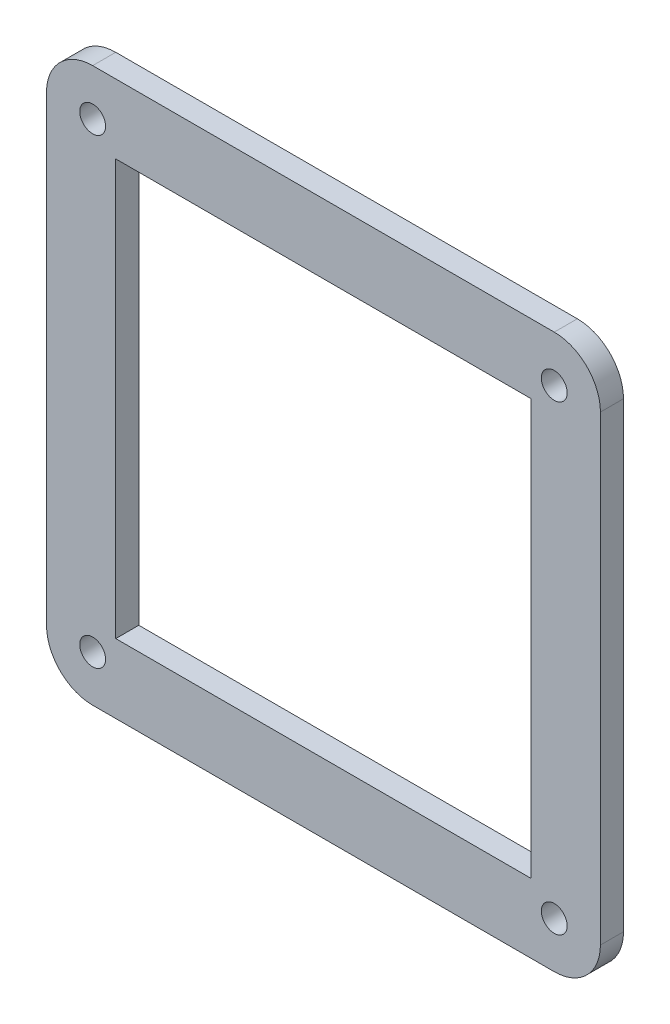
ISO-10303-21;
HEADER;
FILE_DESCRIPTION(('STEP AP214'),'2;1');
FILE_NAME('part.step','',(''),(''),'','','');
FILE_SCHEMA(('AUTOMOTIVE_DESIGN { 1 0 10303 214 1 1 1 1 }'));
ENDSEC;
DATA;
#1=APPLICATION_CONTEXT('core data for automotive mechanical design processes');
#2=APPLICATION_PROTOCOL_DEFINITION('international standard','automotive_design',2000,#1);
#3=PRODUCT_CONTEXT('',#1,'mechanical');
#4=PRODUCT('Part','Part','',(#3));
#5=PRODUCT_RELATED_PRODUCT_CATEGORY('part','',(#4));
#6=PRODUCT_DEFINITION_FORMATION('','',#4);
#7=PRODUCT_DEFINITION_CONTEXT('part definition',#1,'design');
#8=PRODUCT_DEFINITION('design','',#6,#7);
#9=PRODUCT_DEFINITION_SHAPE('','',#8);
#10=(LENGTH_UNIT() NAMED_UNIT(*) SI_UNIT(.MILLI.,.METRE.));
#11=(NAMED_UNIT(*) PLANE_ANGLE_UNIT() SI_UNIT($,.RADIAN.));
#12=(NAMED_UNIT(*) SI_UNIT($,.STERADIAN.) SOLID_ANGLE_UNIT());
#13=UNCERTAINTY_MEASURE_WITH_UNIT(LENGTH_MEASURE(1.E-05),#10,'distance_accuracy_value','');
#14=(GEOMETRIC_REPRESENTATION_CONTEXT(3) GLOBAL_UNCERTAINTY_ASSIGNED_CONTEXT((#13)) GLOBAL_UNIT_ASSIGNED_CONTEXT((#10,
#11,#12)) REPRESENTATION_CONTEXT('',''));
#15=CARTESIAN_POINT('',(0.,0.,0.));
#16=DIRECTION('',(0.,0.,1.));
#17=DIRECTION('',(1.,0.,0.));
#18=AXIS2_PLACEMENT_3D('',#15,#16,#17);
#19=CARTESIAN_POINT('',(-50.,-50.,5.));
#20=DIRECTION('',(0.,0.,-1.));
#21=DIRECTION('',(-1.,0.,0.));
#22=AXIS2_PLACEMENT_3D('',#19,#20,#21);
#23=CYLINDRICAL_SURFACE('',#22,10.0000000000001);
#24=CARTESIAN_POINT('',(-50.,-50.,0.));
#25=DIRECTION('',(0.,0.,-1.));
#26=DIRECTION('',(-1.,0.,0.));
#27=AXIS2_PLACEMENT_3D('',#24,#25,#26);
#28=CIRCLE('',#27,10.0000000000001);
#29=CARTESIAN_POINT('',(-50.,-60.,0.));
#30=VERTEX_POINT('',#29);
#31=CARTESIAN_POINT('',(-60.,-49.9999999999999,0.));
#32=VERTEX_POINT('',#31);
#33=EDGE_CURVE('E166',#30,#32,#28,.T.);
#34=ORIENTED_EDGE('',*,*,#33,.F.);
#35=DIRECTION('',(0.,0.,-1.));
#36=VECTOR('',#35,1.);
#37=CARTESIAN_POINT('',(-50.,-60.,5.));
#38=LINE('',#37,#36);
#39=CARTESIAN_POINT('',(-50.,-60.,5.));
#40=VERTEX_POINT('',#39);
#41=EDGE_CURVE('E11',#40,#30,#38,.T.);
#42=ORIENTED_EDGE('',*,*,#41,.F.);
#43=CARTESIAN_POINT('',(-50.,-50.,5.));
#44=DIRECTION('',(0.,0.,-1.));
#45=DIRECTION('',(-1.,0.,0.));
#46=AXIS2_PLACEMENT_3D('',#43,#44,#45);
#47=CIRCLE('',#46,10.0000000000001);
#48=CARTESIAN_POINT('',(-60.,-49.9999999999999,5.));
#49=VERTEX_POINT('',#48);
#50=EDGE_CURVE('E172',#40,#49,#47,.T.);
#51=ORIENTED_EDGE('',*,*,#50,.T.);
#52=DIRECTION('',(0.,0.,-1.));
#53=VECTOR('',#52,1.);
#54=CARTESIAN_POINT('',(-60.,-49.9999999999999,5.));
#55=LINE('',#54,#53);
#56=EDGE_CURVE('E46',#49,#32,#55,.T.);
#57=ORIENTED_EDGE('',*,*,#56,.T.);
#58=EDGE_LOOP('',(#34,#42,#51,#57));
#59=FACE_BOUND('',#58,.T.);
#60=ADVANCED_FACE('F43',(#59),#23,.T.);
#61=CARTESIAN_POINT('',(50.,-60.,5.));
#62=DIRECTION('',(0.,-1.,0.));
#63=DIRECTION('',(0.,0.,-1.));
#64=AXIS2_PLACEMENT_3D('',#61,#62,#63);
#65=PLANE('',#64);
#66=DIRECTION('',(-1.,0.,0.));
#67=VECTOR('',#66,1.);
#68=CARTESIAN_POINT('',(50.,-60.,0.));
#69=LINE('',#68,#67);
#70=CARTESIAN_POINT('',(50.,-60.,0.));
#71=VERTEX_POINT('',#70);
#72=EDGE_CURVE('E180',#71,#30,#69,.T.);
#73=ORIENTED_EDGE('',*,*,#72,.F.);
#74=DIRECTION('',(0.,0.,-1.));
#75=VECTOR('',#74,1.);
#76=CARTESIAN_POINT('',(50.,-60.,5.));
#77=LINE('',#76,#75);
#78=CARTESIAN_POINT('',(50.,-60.,5.));
#79=VERTEX_POINT('',#78);
#80=EDGE_CURVE('E51',#79,#71,#77,.T.);
#81=ORIENTED_EDGE('',*,*,#80,.F.);
#82=DIRECTION('',(-1.,0.,0.));
#83=VECTOR('',#82,1.);
#84=CARTESIAN_POINT('',(50.,-60.,5.));
#85=LINE('',#84,#83);
#86=EDGE_CURVE('E191',#79,#40,#85,.T.);
#87=ORIENTED_EDGE('',*,*,#86,.T.);
#88=ORIENTED_EDGE('',*,*,#41,.T.);
#89=EDGE_LOOP('',(#73,#81,#87,#88));
#90=FACE_BOUND('',#89,.T.);
#91=ADVANCED_FACE('F245',(#90),#65,.T.);
#92=CARTESIAN_POINT('',(50.,-50.,5.));
#93=DIRECTION('',(0.,0.,-1.));
#94=DIRECTION('',(-1.,0.,0.));
#95=AXIS2_PLACEMENT_3D('',#92,#93,#94);
#96=CYLINDRICAL_SURFACE('',#95,10.);
#97=CARTESIAN_POINT('',(50.,-50.,0.));
#98=DIRECTION('',(0.,0.,-1.));
#99=DIRECTION('',(-1.,0.,0.));
#100=AXIS2_PLACEMENT_3D('',#97,#98,#99);
#101=CIRCLE('',#100,10.);
#102=CARTESIAN_POINT('',(60.,-49.9999999999999,0.));
#103=VERTEX_POINT('',#102);
#104=EDGE_CURVE('E214',#103,#71,#101,.T.);
#105=ORIENTED_EDGE('',*,*,#104,.F.);
#106=DIRECTION('',(0.,0.,-1.));
#107=VECTOR('',#106,1.);
#108=CARTESIAN_POINT('',(60.,-49.9999999999999,5.));
#109=LINE('',#108,#107);
#110=CARTESIAN_POINT('',(60.,-49.9999999999999,5.));
#111=VERTEX_POINT('',#110);
#112=EDGE_CURVE('E222',#111,#103,#109,.T.);
#113=ORIENTED_EDGE('',*,*,#112,.F.);
#114=CARTESIAN_POINT('',(50.,-50.,5.));
#115=DIRECTION('',(0.,0.,-1.));
#116=DIRECTION('',(-1.,0.,0.));
#117=AXIS2_PLACEMENT_3D('',#114,#115,#116);
#118=CIRCLE('',#117,10.);
#119=EDGE_CURVE('E195',#111,#79,#118,.T.);
#120=ORIENTED_EDGE('',*,*,#119,.T.);
#121=ORIENTED_EDGE('',*,*,#80,.T.);
#122=EDGE_LOOP('',(#105,#113,#120,#121));
#123=FACE_BOUND('',#122,.T.);
#124=ADVANCED_FACE('F261',(#123),#96,.T.);
#125=CARTESIAN_POINT('',(60.,50.,5.));
#126=DIRECTION('',(1.,0.,0.));
#127=DIRECTION('',(0.,1.,0.));
#128=AXIS2_PLACEMENT_3D('',#125,#126,#127);
#129=PLANE('',#128);
#130=DIRECTION('',(0.,-1.,0.));
#131=VECTOR('',#130,1.);
#132=CARTESIAN_POINT('',(60.,50.,0.));
#133=LINE('',#132,#131);
#134=CARTESIAN_POINT('',(60.,50.,0.));
#135=VERTEX_POINT('',#134);
#136=EDGE_CURVE('E215',#135,#103,#133,.T.);
#137=ORIENTED_EDGE('',*,*,#136,.F.);
#138=DIRECTION('',(0.,0.,-1.));
#139=VECTOR('',#138,1.);
#140=CARTESIAN_POINT('',(60.,50.,5.));
#141=LINE('',#140,#139);
#142=CARTESIAN_POINT('',(60.,50.,5.));
#143=VERTEX_POINT('',#142);
#144=EDGE_CURVE('E224',#143,#135,#141,.T.);
#145=ORIENTED_EDGE('',*,*,#144,.F.);
#146=DIRECTION('',(0.,-1.,0.));
#147=VECTOR('',#146,1.);
#148=CARTESIAN_POINT('',(60.,50.,5.));
#149=LINE('',#148,#147);
#150=EDGE_CURVE('E188',#143,#111,#149,.T.);
#151=ORIENTED_EDGE('',*,*,#150,.T.);
#152=ORIENTED_EDGE('',*,*,#112,.T.);
#153=EDGE_LOOP('',(#137,#145,#151,#152));
#154=FACE_BOUND('',#153,.T.);
#155=ADVANCED_FACE('F259',(#154),#129,.T.);
#156=CARTESIAN_POINT('',(50.,50.,5.));
#157=DIRECTION('',(0.,0.,-1.));
#158=DIRECTION('',(-1.,0.,0.));
#159=AXIS2_PLACEMENT_3D('',#156,#157,#158);
#160=CYLINDRICAL_SURFACE('',#159,10.);
#161=CARTESIAN_POINT('',(50.,50.,0.));
#162=DIRECTION('',(0.,0.,-1.));
#163=DIRECTION('',(-1.,0.,0.));
#164=AXIS2_PLACEMENT_3D('',#161,#162,#163);
#165=CIRCLE('',#164,10.);
#166=CARTESIAN_POINT('',(50.,60.0000000000001,0.));
#167=VERTEX_POINT('',#166);
#168=EDGE_CURVE('E207',#167,#135,#165,.T.);
#169=ORIENTED_EDGE('',*,*,#168,.F.);
#170=DIRECTION('',(0.,0.,-1.));
#171=VECTOR('',#170,1.);
#172=CARTESIAN_POINT('',(50.,60.0000000000001,5.));
#173=LINE('',#172,#171);
#174=CARTESIAN_POINT('',(50.,60.0000000000001,5.));
#175=VERTEX_POINT('',#174);
#176=EDGE_CURVE('E223',#175,#167,#173,.T.);
#177=ORIENTED_EDGE('',*,*,#176,.F.);
#178=CARTESIAN_POINT('',(50.,50.,5.));
#179=DIRECTION('',(0.,0.,-1.));
#180=DIRECTION('',(-1.,0.,0.));
#181=AXIS2_PLACEMENT_3D('',#178,#179,#180);
#182=CIRCLE('',#181,10.);
#183=EDGE_CURVE('E186',#175,#143,#182,.T.);
#184=ORIENTED_EDGE('',*,*,#183,.T.);
#185=ORIENTED_EDGE('',*,*,#144,.T.);
#186=EDGE_LOOP('',(#169,#177,#184,#185));
#187=FACE_BOUND('',#186,.T.);
#188=ADVANCED_FACE('F254',(#187),#160,.T.);
#189=CARTESIAN_POINT('',(-50.,60.0000000000001,5.));
#190=DIRECTION('',(0.,1.,0.));
#191=DIRECTION('',(0.,0.,1.));
#192=AXIS2_PLACEMENT_3D('',#189,#190,#191);
#193=PLANE('',#192);
#194=DIRECTION('',(1.,0.,0.));
#195=VECTOR('',#194,1.);
#196=CARTESIAN_POINT('',(-50.,60.0000000000001,0.));
#197=LINE('',#196,#195);
#198=CARTESIAN_POINT('',(-50.,60.,0.));
#199=VERTEX_POINT('',#198);
#200=EDGE_CURVE('E206',#199,#167,#197,.T.);
#201=ORIENTED_EDGE('',*,*,#200,.F.);
#202=DIRECTION('',(0.,0.,-1.));
#203=VECTOR('',#202,1.);
#204=CARTESIAN_POINT('',(-50.,60.,5.));
#205=LINE('',#204,#203);
#206=CARTESIAN_POINT('',(-50.,60.,5.));
#207=VERTEX_POINT('',#206);
#208=EDGE_CURVE('E230',#207,#199,#205,.T.);
#209=ORIENTED_EDGE('',*,*,#208,.F.);
#210=DIRECTION('',(1.,0.,0.));
#211=VECTOR('',#210,1.);
#212=CARTESIAN_POINT('',(-50.,60.0000000000001,5.));
#213=LINE('',#212,#211);
#214=EDGE_CURVE('E181',#207,#175,#213,.T.);
#215=ORIENTED_EDGE('',*,*,#214,.T.);
#216=ORIENTED_EDGE('',*,*,#176,.T.);
#217=EDGE_LOOP('',(#201,#209,#215,#216));
#218=FACE_BOUND('',#217,.T.);
#219=ADVANCED_FACE('F251',(#218),#193,.T.);
#220=CARTESIAN_POINT('',(-50.,50.,5.));
#221=DIRECTION('',(0.,0.,-1.));
#222=DIRECTION('',(-1.,0.,0.));
#223=AXIS2_PLACEMENT_3D('',#220,#221,#222);
#224=CYLINDRICAL_SURFACE('',#223,10.0000000000001);
#225=CARTESIAN_POINT('',(-50.,50.,0.));
#226=DIRECTION('',(0.,0.,-1.));
#227=DIRECTION('',(-1.,0.,0.));
#228=AXIS2_PLACEMENT_3D('',#225,#226,#227);
#229=CIRCLE('',#228,10.0000000000001);
#230=CARTESIAN_POINT('',(-60.,50.,0.));
#231=VERTEX_POINT('',#230);
#232=EDGE_CURVE('E201',#231,#199,#229,.T.);
#233=ORIENTED_EDGE('',*,*,#232,.F.);
#234=DIRECTION('',(0.,0.,-1.));
#235=VECTOR('',#234,1.);
#236=CARTESIAN_POINT('',(-60.,50.,5.));
#237=LINE('',#236,#235);
#238=CARTESIAN_POINT('',(-60.,50.,5.));
#239=VERTEX_POINT('',#238);
#240=EDGE_CURVE('E227',#239,#231,#237,.T.);
#241=ORIENTED_EDGE('',*,*,#240,.F.);
#242=CARTESIAN_POINT('',(-50.,50.,5.));
#243=DIRECTION('',(0.,0.,-1.));
#244=DIRECTION('',(-1.,0.,0.));
#245=AXIS2_PLACEMENT_3D('',#242,#243,#244);
#246=CIRCLE('',#245,10.0000000000001);
#247=EDGE_CURVE('E176',#239,#207,#246,.T.);
#248=ORIENTED_EDGE('',*,*,#247,.T.);
#249=ORIENTED_EDGE('',*,*,#208,.T.);
#250=EDGE_LOOP('',(#233,#241,#248,#249));
#251=FACE_BOUND('',#250,.T.);
#252=ADVANCED_FACE('F249',(#251),#224,.T.);
#253=CARTESIAN_POINT('',(-60.,-49.9999999999999,5.));
#254=DIRECTION('',(-1.,0.,0.));
#255=DIRECTION('',(0.,0.,1.));
#256=AXIS2_PLACEMENT_3D('',#253,#254,#255);
#257=PLANE('',#256);
#258=DIRECTION('',(0.,1.,0.));
#259=VECTOR('',#258,1.);
#260=CARTESIAN_POINT('',(-60.,-49.9999999999999,0.));
#261=LINE('',#260,#259);
#262=EDGE_CURVE('E199',#32,#231,#261,.T.);
#263=ORIENTED_EDGE('',*,*,#262,.F.);
#264=ORIENTED_EDGE('',*,*,#56,.F.);
#265=DIRECTION('',(0.,1.,0.));
#266=VECTOR('',#265,1.);
#267=CARTESIAN_POINT('',(-60.,-49.9999999999999,5.));
#268=LINE('',#267,#266);
#269=EDGE_CURVE('E177',#49,#239,#268,.T.);
#270=ORIENTED_EDGE('',*,*,#269,.T.);
#271=ORIENTED_EDGE('',*,*,#240,.T.);
#272=EDGE_LOOP('',(#263,#264,#270,#271));
#273=FACE_BOUND('',#272,.T.);
#274=ADVANCED_FACE('F237',(#273),#257,.T.);
#275=CARTESIAN_POINT('',(-50.,-50.,5.));
#276=DIRECTION('',(0.,0.,-1.));
#277=DIRECTION('',(-1.,0.,0.));
#278=AXIS2_PLACEMENT_3D('',#275,#276,#277);
#279=PLANE('',#278);
#280=CARTESIAN_POINT('',(-50.,50.,5.));
#281=DIRECTION('',(0.,0.,-1.));
#282=DIRECTION('',(1.,0.,0.));
#283=AXIS2_PLACEMENT_3D('',#280,#281,#282);
#284=CIRCLE('',#283,2.8);
#285=CARTESIAN_POINT('',(-47.2,50.,5.));
#286=VERTEX_POINT('',#285);
#287=EDGE_CURVE('E420',#286,#286,#284,.T.);
#288=ORIENTED_EDGE('',*,*,#287,.T.);
#289=EDGE_LOOP('',(#288));
#290=FACE_BOUND('',#289,.T.);
#291=CARTESIAN_POINT('',(50.,50.,5.));
#292=DIRECTION('',(0.,0.,-1.));
#293=DIRECTION('',(1.,0.,0.));
#294=AXIS2_PLACEMENT_3D('',#291,#292,#293);
#295=CIRCLE('',#294,2.8);
#296=CARTESIAN_POINT('',(52.8,50.,5.));
#297=VERTEX_POINT('',#296);
#298=EDGE_CURVE('E430',#297,#297,#295,.T.);
#299=ORIENTED_EDGE('',*,*,#298,.T.);
#300=EDGE_LOOP('',(#299));
#301=FACE_BOUND('',#300,.T.);
#302=CARTESIAN_POINT('',(50.,-50.,5.));
#303=DIRECTION('',(0.,0.,-1.));
#304=DIRECTION('',(1.,0.,0.));
#305=AXIS2_PLACEMENT_3D('',#302,#303,#304);
#306=CIRCLE('',#305,2.8);
#307=CARTESIAN_POINT('',(52.8,-50.,5.));
#308=VERTEX_POINT('',#307);
#309=EDGE_CURVE('E433',#308,#308,#306,.T.);
#310=ORIENTED_EDGE('',*,*,#309,.T.);
#311=EDGE_LOOP('',(#310));
#312=FACE_BOUND('',#311,.T.);
#313=CARTESIAN_POINT('',(-50.,-50.,5.));
#314=DIRECTION('',(0.,0.,-1.));
#315=DIRECTION('',(1.,0.,0.));
#316=AXIS2_PLACEMENT_3D('',#313,#314,#315);
#317=CIRCLE('',#316,2.8);
#318=CARTESIAN_POINT('',(-47.2,-50.,5.));
#319=VERTEX_POINT('',#318);
#320=EDGE_CURVE('E162',#319,#319,#317,.T.);
#321=ORIENTED_EDGE('',*,*,#320,.T.);
#322=EDGE_LOOP('',(#321));
#323=FACE_BOUND('',#322,.T.);
#324=DIRECTION('',(0.,-1.,0.));
#325=VECTOR('',#324,1.);
#326=CARTESIAN_POINT('',(45.,-44.9999999999999,5.));
#327=LINE('',#326,#325);
#328=CARTESIAN_POINT('',(45.,45.,5.));
#329=VERTEX_POINT('',#328);
#330=CARTESIAN_POINT('',(45.,-44.9999999999999,5.));
#331=VERTEX_POINT('',#330);
#332=EDGE_CURVE('E136',#329,#331,#327,.T.);
#333=ORIENTED_EDGE('',*,*,#332,.T.);
#334=DIRECTION('',(-1.,0.,0.));
#335=VECTOR('',#334,1.);
#336=CARTESIAN_POINT('',(-45.,-44.9999999999999,5.));
#337=LINE('',#336,#335);
#338=CARTESIAN_POINT('',(-45.,-44.9999999999999,5.));
#339=VERTEX_POINT('',#338);
#340=EDGE_CURVE('E133',#331,#339,#337,.T.);
#341=ORIENTED_EDGE('',*,*,#340,.T.);
#342=DIRECTION('',(0.,1.,0.));
#343=VECTOR('',#342,1.);
#344=CARTESIAN_POINT('',(-45.,45.,5.));
#345=LINE('',#344,#343);
#346=CARTESIAN_POINT('',(-45.,45.,5.));
#347=VERTEX_POINT('',#346);
#348=EDGE_CURVE('E141',#339,#347,#345,.T.);
#349=ORIENTED_EDGE('',*,*,#348,.T.);
#350=DIRECTION('',(1.,0.,0.));
#351=VECTOR('',#350,1.);
#352=CARTESIAN_POINT('',(45.,45.,5.));
#353=LINE('',#352,#351);
#354=EDGE_CURVE('E56',#347,#329,#353,.T.);
#355=ORIENTED_EDGE('',*,*,#354,.T.);
#356=EDGE_LOOP('',(#333,#341,#349,#355));
#357=FACE_BOUND('',#356,.T.);
#358=ORIENTED_EDGE('',*,*,#50,.F.);
#359=ORIENTED_EDGE('',*,*,#86,.F.);
#360=ORIENTED_EDGE('',*,*,#119,.F.);
#361=ORIENTED_EDGE('',*,*,#150,.F.);
#362=ORIENTED_EDGE('',*,*,#183,.F.);
#363=ORIENTED_EDGE('',*,*,#214,.F.);
#364=ORIENTED_EDGE('',*,*,#247,.F.);
#365=ORIENTED_EDGE('',*,*,#269,.F.);
#366=EDGE_LOOP('',(#358,#359,#360,#361,#362,#363,#364,#365));
#367=FACE_BOUND('',#366,.T.);
#368=ADVANCED_FACE('F150',(#290,#301,#312,#323,#357,#367),#279,.F.);
#369=CARTESIAN_POINT('',(-50.,-50.,0.));
#370=DIRECTION('',(0.,0.,-1.));
#371=DIRECTION('',(-1.,0.,0.));
#372=AXIS2_PLACEMENT_3D('',#369,#370,#371);
#373=PLANE('',#372);
#374=CARTESIAN_POINT('',(-50.,50.,0.));
#375=DIRECTION('',(0.,0.,-1.));
#376=DIRECTION('',(1.,0.,0.));
#377=AXIS2_PLACEMENT_3D('',#374,#375,#376);
#378=CIRCLE('',#377,2.8);
#379=CARTESIAN_POINT('',(-47.2,50.,0.));
#380=VERTEX_POINT('',#379);
#381=EDGE_CURVE('E425',#380,#380,#378,.T.);
#382=ORIENTED_EDGE('',*,*,#381,.F.);
#383=EDGE_LOOP('',(#382));
#384=FACE_BOUND('',#383,.T.);
#385=CARTESIAN_POINT('',(50.,50.,0.));
#386=DIRECTION('',(0.,0.,-1.));
#387=DIRECTION('',(1.,0.,0.));
#388=AXIS2_PLACEMENT_3D('',#385,#386,#387);
#389=CIRCLE('',#388,2.8);
#390=CARTESIAN_POINT('',(52.8,50.,0.));
#391=VERTEX_POINT('',#390);
#392=EDGE_CURVE('E424',#391,#391,#389,.T.);
#393=ORIENTED_EDGE('',*,*,#392,.F.);
#394=EDGE_LOOP('',(#393));
#395=FACE_BOUND('',#394,.T.);
#396=CARTESIAN_POINT('',(50.,-50.,0.));
#397=DIRECTION('',(0.,0.,-1.));
#398=DIRECTION('',(1.,0.,0.));
#399=AXIS2_PLACEMENT_3D('',#396,#397,#398);
#400=CIRCLE('',#399,2.8);
#401=CARTESIAN_POINT('',(52.8,-50.,0.));
#402=VERTEX_POINT('',#401);
#403=EDGE_CURVE('E429',#402,#402,#400,.T.);
#404=ORIENTED_EDGE('',*,*,#403,.F.);
#405=EDGE_LOOP('',(#404));
#406=FACE_BOUND('',#405,.T.);
#407=CARTESIAN_POINT('',(-50.,-50.,0.));
#408=DIRECTION('',(0.,0.,-1.));
#409=DIRECTION('',(1.,0.,0.));
#410=AXIS2_PLACEMENT_3D('',#407,#408,#409);
#411=CIRCLE('',#410,2.8);
#412=CARTESIAN_POINT('',(-47.2,-50.,0.));
#413=VERTEX_POINT('',#412);
#414=EDGE_CURVE('E156',#413,#413,#411,.T.);
#415=ORIENTED_EDGE('',*,*,#414,.F.);
#416=EDGE_LOOP('',(#415));
#417=FACE_BOUND('',#416,.T.);
#418=DIRECTION('',(-1.,0.,0.));
#419=VECTOR('',#418,1.);
#420=CARTESIAN_POINT('',(-45.,-44.9999999999999,0.));
#421=LINE('',#420,#419);
#422=CARTESIAN_POINT('',(45.,-44.9999999999999,0.));
#423=VERTEX_POINT('',#422);
#424=CARTESIAN_POINT('',(-45.,-44.9999999999999,0.));
#425=VERTEX_POINT('',#424);
#426=EDGE_CURVE('E70',#423,#425,#421,.T.);
#427=ORIENTED_EDGE('',*,*,#426,.F.);
#428=DIRECTION('',(0.,-1.,0.));
#429=VECTOR('',#428,1.);
#430=CARTESIAN_POINT('',(45.,-44.9999999999999,0.));
#431=LINE('',#430,#429);
#432=CARTESIAN_POINT('',(45.,45.,0.));
#433=VERTEX_POINT('',#432);
#434=EDGE_CURVE('E147',#433,#423,#431,.T.);
#435=ORIENTED_EDGE('',*,*,#434,.F.);
#436=DIRECTION('',(1.,0.,0.));
#437=VECTOR('',#436,1.);
#438=CARTESIAN_POINT('',(45.,45.,0.));
#439=LINE('',#438,#437);
#440=CARTESIAN_POINT('',(-45.,45.,0.));
#441=VERTEX_POINT('',#440);
#442=EDGE_CURVE('E153',#441,#433,#439,.T.);
#443=ORIENTED_EDGE('',*,*,#442,.F.);
#444=DIRECTION('',(0.,1.,0.));
#445=VECTOR('',#444,1.);
#446=CARTESIAN_POINT('',(-45.,45.,0.));
#447=LINE('',#446,#445);
#448=EDGE_CURVE('E165',#425,#441,#447,.T.);
#449=ORIENTED_EDGE('',*,*,#448,.F.);
#450=EDGE_LOOP('',(#427,#435,#443,#449));
#451=FACE_BOUND('',#450,.T.);
#452=ORIENTED_EDGE('',*,*,#33,.T.);
#453=ORIENTED_EDGE('',*,*,#262,.T.);
#454=ORIENTED_EDGE('',*,*,#232,.T.);
#455=ORIENTED_EDGE('',*,*,#200,.T.);
#456=ORIENTED_EDGE('',*,*,#168,.T.);
#457=ORIENTED_EDGE('',*,*,#136,.T.);
#458=ORIENTED_EDGE('',*,*,#104,.T.);
#459=ORIENTED_EDGE('',*,*,#72,.T.);
#460=EDGE_LOOP('',(#452,#453,#454,#455,#456,#457,#458,#459));
#461=FACE_BOUND('',#460,.T.);
#462=ADVANCED_FACE('F236',(#384,#395,#406,#417,#451,#461),#373,.T.);
#463=CARTESIAN_POINT('',(-45.,-44.9999999999999,5.));
#464=DIRECTION('',(0.,-1.,0.));
#465=DIRECTION('',(1.,0.,0.));
#466=AXIS2_PLACEMENT_3D('',#463,#464,#465);
#467=PLANE('',#466);
#468=ORIENTED_EDGE('',*,*,#426,.T.);
#469=DIRECTION('',(0.,0.,-1.));
#470=VECTOR('',#469,1.);
#471=CARTESIAN_POINT('',(-45.,-44.9999999999999,5.));
#472=LINE('',#471,#470);
#473=EDGE_CURVE('E128',#339,#425,#472,.T.);
#474=ORIENTED_EDGE('',*,*,#473,.F.);
#475=ORIENTED_EDGE('',*,*,#340,.F.);
#476=DIRECTION('',(0.,0.,-1.));
#477=VECTOR('',#476,1.);
#478=CARTESIAN_POINT('',(45.,-44.9999999999999,5.));
#479=LINE('',#478,#477);
#480=EDGE_CURVE('E170',#331,#423,#479,.T.);
#481=ORIENTED_EDGE('',*,*,#480,.T.);
#482=EDGE_LOOP('',(#468,#474,#475,#481));
#483=FACE_BOUND('',#482,.T.);
#484=ADVANCED_FACE('F135',(#483),#467,.F.);
#485=CARTESIAN_POINT('',(45.,-44.9999999999999,5.));
#486=DIRECTION('',(1.,0.,0.));
#487=DIRECTION('',(0.,0.,-1.));
#488=AXIS2_PLACEMENT_3D('',#485,#486,#487);
#489=PLANE('',#488);
#490=ORIENTED_EDGE('',*,*,#434,.T.);
#491=ORIENTED_EDGE('',*,*,#480,.F.);
#492=ORIENTED_EDGE('',*,*,#332,.F.);
#493=DIRECTION('',(0.,0.,-1.));
#494=VECTOR('',#493,1.);
#495=CARTESIAN_POINT('',(45.,45.,5.));
#496=LINE('',#495,#494);
#497=EDGE_CURVE('E168',#329,#433,#496,.T.);
#498=ORIENTED_EDGE('',*,*,#497,.T.);
#499=EDGE_LOOP('',(#490,#491,#492,#498));
#500=FACE_BOUND('',#499,.T.);
#501=ADVANCED_FACE('F350',(#500),#489,.F.);
#502=CARTESIAN_POINT('',(45.,45.,5.));
#503=DIRECTION('',(0.,1.,0.));
#504=DIRECTION('',(0.,0.,1.));
#505=AXIS2_PLACEMENT_3D('',#502,#503,#504);
#506=PLANE('',#505);
#507=ORIENTED_EDGE('',*,*,#442,.T.);
#508=ORIENTED_EDGE('',*,*,#497,.F.);
#509=ORIENTED_EDGE('',*,*,#354,.F.);
#510=DIRECTION('',(0.,0.,-1.));
#511=VECTOR('',#510,1.);
#512=CARTESIAN_POINT('',(-45.,45.,5.));
#513=LINE('',#512,#511);
#514=EDGE_CURVE('E139',#347,#441,#513,.T.);
#515=ORIENTED_EDGE('',*,*,#514,.T.);
#516=EDGE_LOOP('',(#507,#508,#509,#515));
#517=FACE_BOUND('',#516,.T.);
#518=ADVANCED_FACE('F357',(#517),#506,.F.);
#519=CARTESIAN_POINT('',(-45.,45.,5.));
#520=DIRECTION('',(-1.,0.,0.));
#521=DIRECTION('',(0.,0.,1.));
#522=AXIS2_PLACEMENT_3D('',#519,#520,#521);
#523=PLANE('',#522);
#524=ORIENTED_EDGE('',*,*,#448,.T.);
#525=ORIENTED_EDGE('',*,*,#514,.F.);
#526=ORIENTED_EDGE('',*,*,#348,.F.);
#527=ORIENTED_EDGE('',*,*,#473,.T.);
#528=EDGE_LOOP('',(#524,#525,#526,#527));
#529=FACE_BOUND('',#528,.T.);
#530=ADVANCED_FACE('F145',(#529),#523,.F.);
#531=CARTESIAN_POINT('',(-50.,-50.,5.));
#532=DIRECTION('',(0.,0.,-1.));
#533=DIRECTION('',(-1.,0.,0.));
#534=AXIS2_PLACEMENT_3D('',#531,#532,#533);
#535=CYLINDRICAL_SURFACE('',#534,2.8);
#536=ORIENTED_EDGE('',*,*,#320,.F.);
#537=EDGE_LOOP('',(#536));
#538=FACE_BOUND('',#537,.T.);
#539=ORIENTED_EDGE('',*,*,#414,.T.);
#540=EDGE_LOOP('',(#539));
#541=FACE_BOUND('',#540,.T.);
#542=ADVANCED_FACE('F372',(#538,#541),#535,.F.);
#543=CARTESIAN_POINT('',(50.,-50.,5.));
#544=DIRECTION('',(0.,0.,-1.));
#545=DIRECTION('',(-1.,0.,0.));
#546=AXIS2_PLACEMENT_3D('',#543,#544,#545);
#547=CYLINDRICAL_SURFACE('',#546,2.8);
#548=ORIENTED_EDGE('',*,*,#309,.F.);
#549=EDGE_LOOP('',(#548));
#550=FACE_BOUND('',#549,.T.);
#551=ORIENTED_EDGE('',*,*,#403,.T.);
#552=EDGE_LOOP('',(#551));
#553=FACE_BOUND('',#552,.T.);
#554=ADVANCED_FACE('F382',(#550,#553),#547,.F.);
#555=CARTESIAN_POINT('',(50.,50.,5.));
#556=DIRECTION('',(0.,0.,-1.));
#557=DIRECTION('',(-1.,0.,0.));
#558=AXIS2_PLACEMENT_3D('',#555,#556,#557);
#559=CYLINDRICAL_SURFACE('',#558,2.8);
#560=ORIENTED_EDGE('',*,*,#298,.F.);
#561=EDGE_LOOP('',(#560));
#562=FACE_BOUND('',#561,.T.);
#563=ORIENTED_EDGE('',*,*,#392,.T.);
#564=EDGE_LOOP('',(#563));
#565=FACE_BOUND('',#564,.T.);
#566=ADVANCED_FACE('F392',(#562,#565),#559,.F.);
#567=CARTESIAN_POINT('',(-50.,50.,5.));
#568=DIRECTION('',(0.,0.,-1.));
#569=DIRECTION('',(-1.,0.,0.));
#570=AXIS2_PLACEMENT_3D('',#567,#568,#569);
#571=CYLINDRICAL_SURFACE('',#570,2.8);
#572=ORIENTED_EDGE('',*,*,#287,.F.);
#573=EDGE_LOOP('',(#572));
#574=FACE_BOUND('',#573,.T.);
#575=ORIENTED_EDGE('',*,*,#381,.T.);
#576=EDGE_LOOP('',(#575));
#577=FACE_BOUND('',#576,.T.);
#578=ADVANCED_FACE('F401',(#574,#577),#571,.F.);
#579=CLOSED_SHELL('',(#60,#91,#124,#155,#188,#219,#252,#274,#368,#462,#484,#501,#518,#530,#542,
#554,#566,#578));
#580=MANIFOLD_SOLID_BREP('B2',#579);
#581=ADVANCED_BREP_SHAPE_REPRESENTATION('',(#18,#580),#14);
#582=SHAPE_DEFINITION_REPRESENTATION(#9,#581);
ENDSEC;
END-ISO-10303-21;
